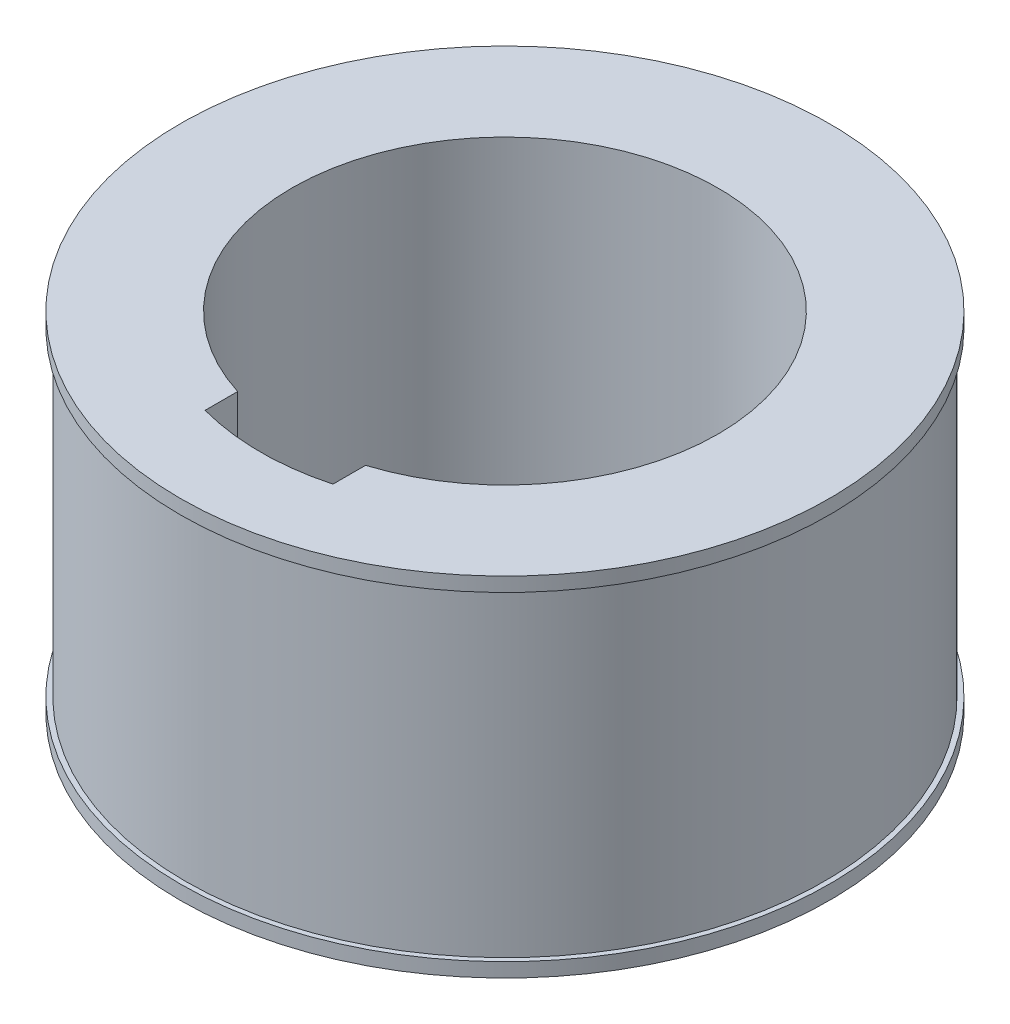
ISO-10303-21;
HEADER;
FILE_DESCRIPTION(('STEP AP214'),'2;1');
FILE_NAME('part.step','',(''),(''),'','','');
FILE_SCHEMA(('AUTOMOTIVE_DESIGN { 1 0 10303 214 1 1 1 1 }'));
ENDSEC;
DATA;
#1=APPLICATION_CONTEXT('core data for automotive mechanical design processes');
#2=APPLICATION_PROTOCOL_DEFINITION('international standard','automotive_design',2000,#1);
#3=PRODUCT_CONTEXT('',#1,'mechanical');
#4=PRODUCT('Part','Part','',(#3));
#5=PRODUCT_RELATED_PRODUCT_CATEGORY('part','',(#4));
#6=PRODUCT_DEFINITION_FORMATION('','',#4);
#7=PRODUCT_DEFINITION_CONTEXT('part definition',#1,'design');
#8=PRODUCT_DEFINITION('design','',#6,#7);
#9=PRODUCT_DEFINITION_SHAPE('','',#8);
#10=(LENGTH_UNIT() NAMED_UNIT(*) SI_UNIT(.MILLI.,.METRE.));
#11=(NAMED_UNIT(*) PLANE_ANGLE_UNIT() SI_UNIT($,.RADIAN.));
#12=(NAMED_UNIT(*) SI_UNIT($,.STERADIAN.) SOLID_ANGLE_UNIT());
#13=UNCERTAINTY_MEASURE_WITH_UNIT(LENGTH_MEASURE(1.E-05),#10,'distance_accuracy_value','');
#14=(GEOMETRIC_REPRESENTATION_CONTEXT(3) GLOBAL_UNCERTAINTY_ASSIGNED_CONTEXT((#13)) GLOBAL_UNIT_ASSIGNED_CONTEXT((#10,
#11,#12)) REPRESENTATION_CONTEXT('',''));
#15=CARTESIAN_POINT('',(0.,0.,0.));
#16=DIRECTION('',(0.,0.,1.));
#17=DIRECTION('',(1.,0.,0.));
#18=AXIS2_PLACEMENT_3D('',#15,#16,#17);
#19=CARTESIAN_POINT('',(0.,22.5,0.));
#20=DIRECTION('',(0.,-1.,0.));
#21=DIRECTION('',(0.,0.,-1.));
#22=AXIS2_PLACEMENT_3D('',#19,#20,#21);
#23=CYLINDRICAL_SURFACE('',#22,45.);
#24=CARTESIAN_POINT('',(0.,22.5,0.));
#25=DIRECTION('',(0.,1.,0.));
#26=DIRECTION('',(0.,0.,1.));
#27=AXIS2_PLACEMENT_3D('',#24,#25,#26);
#28=CIRCLE('',#27,45.);
#29=CARTESIAN_POINT('',(0.,22.5,-45.));
#30=VERTEX_POINT('',#29);
#31=EDGE_CURVE('E11',#30,#30,#28,.T.);
#32=CARTESIAN_POINT('',(0.,-22.5,0.));
#33=DIRECTION('',(0.,1.,0.));
#34=DIRECTION('',(0.,0.,1.));
#35=AXIS2_PLACEMENT_3D('',#32,#33,#34);
#36=CIRCLE('',#35,45.);
#37=CARTESIAN_POINT('',(0.,-22.5,-45.));
#38=VERTEX_POINT('',#37);
#39=EDGE_CURVE('E119',#38,#38,#36,.T.);
#40=CARTESIAN_POINT('',(0.,22.5,-45.));
#41=CARTESIAN_POINT('',(0.,22.03125,-45.));
#42=CARTESIAN_POINT('',(0.,21.5625,-45.));
#43=CARTESIAN_POINT('',(0.,20.625,-45.));
#44=CARTESIAN_POINT('',(0.,20.15625,-45.));
#45=CARTESIAN_POINT('',(0.,19.21875,-45.));
#46=CARTESIAN_POINT('',(0.,18.75,-45.));
#47=CARTESIAN_POINT('',(0.,17.8125,-45.));
#48=CARTESIAN_POINT('',(0.,17.34375,-45.));
#49=CARTESIAN_POINT('',(0.,16.40625,-45.));
#50=CARTESIAN_POINT('',(0.,15.9375,-45.));
#51=CARTESIAN_POINT('',(0.,15.,-45.));
#52=CARTESIAN_POINT('',(0.,14.53125,-45.));
#53=CARTESIAN_POINT('',(0.,13.59375,-45.));
#54=CARTESIAN_POINT('',(0.,13.125,-45.));
#55=CARTESIAN_POINT('',(0.,12.1875,-45.));
#56=CARTESIAN_POINT('',(0.,11.71875,-45.));
#57=CARTESIAN_POINT('',(0.,10.78125,-45.));
#58=CARTESIAN_POINT('',(0.,10.3125,-45.));
#59=CARTESIAN_POINT('',(0.,9.37499999999999,-45.));
#60=CARTESIAN_POINT('',(0.,8.90625,-45.));
#61=CARTESIAN_POINT('',(0.,7.96874999999999,-45.));
#62=CARTESIAN_POINT('',(0.,7.5,-45.));
#63=CARTESIAN_POINT('',(0.,6.5625,-45.));
#64=CARTESIAN_POINT('',(0.,6.09375,-45.));
#65=CARTESIAN_POINT('',(0.,5.15625,-45.));
#66=CARTESIAN_POINT('',(0.,4.6875,-45.));
#67=CARTESIAN_POINT('',(0.,3.75,-45.));
#68=CARTESIAN_POINT('',(0.,3.28125,-45.));
#69=CARTESIAN_POINT('',(0.,2.34375,-45.));
#70=CARTESIAN_POINT('',(0.,1.875,-45.));
#71=CARTESIAN_POINT('',(0.,0.937499999999997,-45.));
#72=CARTESIAN_POINT('',(0.,0.468749999999997,-45.));
#73=CARTESIAN_POINT('',(0.,-0.468750000000004,-45.));
#74=CARTESIAN_POINT('',(0.,-0.937500000000004,-45.));
#75=CARTESIAN_POINT('',(0.,-1.87500000000001,-45.));
#76=CARTESIAN_POINT('',(0.,-2.34375000000001,-45.));
#77=CARTESIAN_POINT('',(0.,-3.28125,-45.));
#78=CARTESIAN_POINT('',(0.,-3.75,-45.));
#79=CARTESIAN_POINT('',(0.,-4.6875,-45.));
#80=CARTESIAN_POINT('',(0.,-5.15625,-45.));
#81=CARTESIAN_POINT('',(0.,-6.09375000000001,-45.));
#82=CARTESIAN_POINT('',(0.,-6.56250000000001,-45.));
#83=CARTESIAN_POINT('',(0.,-7.50000000000001,-45.));
#84=CARTESIAN_POINT('',(0.,-7.96875000000001,-45.));
#85=CARTESIAN_POINT('',(0.,-8.90625,-45.));
#86=CARTESIAN_POINT('',(0.,-9.37500000000001,-45.));
#87=CARTESIAN_POINT('',(0.,-10.3125,-45.));
#88=CARTESIAN_POINT('',(0.,-10.78125,-45.));
#89=CARTESIAN_POINT('',(0.,-11.71875,-45.));
#90=CARTESIAN_POINT('',(0.,-12.1875,-45.));
#91=CARTESIAN_POINT('',(0.,-13.125,-45.));
#92=CARTESIAN_POINT('',(0.,-13.59375,-45.));
#93=CARTESIAN_POINT('',(0.,-14.53125,-45.));
#94=CARTESIAN_POINT('',(0.,-15.,-45.));
#95=CARTESIAN_POINT('',(0.,-15.9375,-45.));
#96=CARTESIAN_POINT('',(0.,-16.40625,-45.));
#97=CARTESIAN_POINT('',(0.,-17.34375,-45.));
#98=CARTESIAN_POINT('',(0.,-17.8125,-45.));
#99=CARTESIAN_POINT('',(0.,-18.75,-45.));
#100=CARTESIAN_POINT('',(0.,-19.21875,-45.));
#101=CARTESIAN_POINT('',(0.,-20.15625,-45.));
#102=CARTESIAN_POINT('',(0.,-20.625,-45.));
#103=CARTESIAN_POINT('',(0.,-21.5625,-45.));
#104=CARTESIAN_POINT('',(0.,-22.03125,-45.));
#105=CARTESIAN_POINT('',(0.,-22.5,-45.));
#106=B_SPLINE_CURVE_WITH_KNOTS('',3,(#40,#41,#42,#43,#44,#45,#46,#47,#48,#49,#50,#51,#52,#53,
#54,#55,#56,#57,#58,#59,#60,#61,#62,#63,#64,#65,#66,#67,#68,#69,#70,#71,#72,#73,#74,#75,#76,#77,
#78,#79,#80,#81,#82,#83,#84,#85,#86,#87,#88,#89,#90,#91,#92,#93,#94,#95,#96,#97,#98,#99,#100,
#101,#102,#103,#104,#105),.UNSPECIFIED.,.F.,.F.,(4,2,2,2,2,2,2,2,2,2,2,2,2,2,2,2,2,2,2,2,2,2,2,
2,2,2,2,2,2,2,2,2,4),(0.,1.40625,2.8125,4.21875,5.625,7.03125,8.4375,9.84375,11.25,12.65625,
14.0625,15.46875,16.875,18.28125,19.6875,21.09375,22.5,23.90625,25.3125,26.71875,28.125,
29.53125,30.9375,32.34375,33.75,35.15625,36.5625,37.96875,39.375,40.78125,42.1875,43.59375,45.),.UNSPECIFIED.);
#107=EDGE_CURVE('BSEAM39',#30,#38,#106,.T.);
#108=ORIENTED_EDGE('',*,*,#31,.F.);
#109=ORIENTED_EDGE('',*,*,#39,.T.);
#110=ORIENTED_EDGE('',*,*,#107,.T.);
#111=ORIENTED_EDGE('',*,*,#107,.F.);
#112=EDGE_LOOP('',(#108,#110,#109,#111));
#113=FACE_BOUND('',#112,.T.);
#114=ADVANCED_FACE('F39',(#113),#23,.T.);
#115=CARTESIAN_POINT('',(0.,24.5,0.));
#116=DIRECTION('',(0.,-1.,0.));
#117=DIRECTION('',(0.,0.,-1.));
#118=AXIS2_PLACEMENT_3D('',#115,#116,#117);
#119=CYLINDRICAL_SURFACE('',#118,45.69);
#120=CARTESIAN_POINT('',(0.,24.5,0.));
#121=DIRECTION('',(0.,1.,0.));
#122=DIRECTION('',(0.,0.,1.));
#123=AXIS2_PLACEMENT_3D('',#120,#121,#122);
#124=CIRCLE('',#123,45.69);
#125=CARTESIAN_POINT('',(0.,24.5,45.69));
#126=VERTEX_POINT('',#125);
#127=EDGE_CURVE('E47',#126,#126,#124,.T.);
#128=ORIENTED_EDGE('',*,*,#127,.F.);
#129=EDGE_LOOP('',(#128));
#130=FACE_BOUND('',#129,.T.);
#131=CARTESIAN_POINT('',(0.,22.5,0.));
#132=DIRECTION('',(0.,1.,0.));
#133=DIRECTION('',(0.,0.,1.));
#134=AXIS2_PLACEMENT_3D('',#131,#132,#133);
#135=CIRCLE('',#134,45.69);
#136=CARTESIAN_POINT('',(0.,22.5,45.69));
#137=VERTEX_POINT('',#136);
#138=EDGE_CURVE('E125',#137,#137,#135,.T.);
#139=ORIENTED_EDGE('',*,*,#138,.T.);
#140=EDGE_LOOP('',(#139));
#141=FACE_BOUND('',#140,.T.);
#142=ADVANCED_FACE('F163',(#130,#141),#119,.T.);
#143=CARTESIAN_POINT('',(0.,24.5,0.));
#144=DIRECTION('',(0.,1.,0.));
#145=DIRECTION('',(0.,0.,1.));
#146=AXIS2_PLACEMENT_3D('',#143,#144,#145);
#147=PLANE('',#146);
#148=DIRECTION('',(0.,0.,1.));
#149=VECTOR('',#148,1.);
#150=CARTESIAN_POINT('',(9.,24.5,28.6181760425084));
#151=LINE('',#150,#149);
#152=CARTESIAN_POINT('',(9.,24.5,28.6181760425084));
#153=VERTEX_POINT('',#152);
#154=CARTESIAN_POINT('',(9.,24.5,33.2018071797304));
#155=VERTEX_POINT('',#154);
#156=EDGE_CURVE('E100',#153,#155,#151,.T.);
#157=ORIENTED_EDGE('',*,*,#156,.T.);
#158=CARTESIAN_POINT('',(0.,24.5,0.));
#159=DIRECTION('',(0.,-1.,0.));
#160=DIRECTION('',(0.,0.,-1.));
#161=AXIS2_PLACEMENT_3D('',#158,#159,#160);
#162=CIRCLE('',#161,34.4);
#163=CARTESIAN_POINT('',(-9.,24.5,33.2018071797304));
#164=VERTEX_POINT('',#163);
#165=EDGE_CURVE('E99',#155,#164,#162,.T.);
#166=ORIENTED_EDGE('',*,*,#165,.T.);
#167=DIRECTION('',(0.,0.,-1.));
#168=VECTOR('',#167,1.);
#169=CARTESIAN_POINT('',(-9.,24.5,28.6181760425084));
#170=LINE('',#169,#168);
#171=CARTESIAN_POINT('',(-8.99999999999999,24.5,28.6181760425084));
#172=VERTEX_POINT('',#171);
#173=EDGE_CURVE('E85',#164,#172,#170,.T.);
#174=ORIENTED_EDGE('',*,*,#173,.T.);
#175=CARTESIAN_POINT('',(0.,24.5,0.));
#176=DIRECTION('',(0.,-1.,0.));
#177=DIRECTION('',(0.,0.,-1.));
#178=AXIS2_PLACEMENT_3D('',#175,#176,#177);
#179=CIRCLE('',#178,30.);
#180=EDGE_CURVE('E98',#172,#153,#179,.T.);
#181=ORIENTED_EDGE('',*,*,#180,.T.);
#182=EDGE_LOOP('',(#157,#166,#174,#181));
#183=FACE_BOUND('',#182,.T.);
#184=ORIENTED_EDGE('',*,*,#127,.T.);
#185=EDGE_LOOP('',(#184));
#186=FACE_BOUND('',#185,.T.);
#187=ADVANCED_FACE('F96',(#183,#186),#147,.T.);
#188=CARTESIAN_POINT('',(0.,22.5,0.));
#189=DIRECTION('',(0.,1.,0.));
#190=DIRECTION('',(0.,0.,1.));
#191=AXIS2_PLACEMENT_3D('',#188,#189,#190);
#192=PLANE('',#191);
#193=ORIENTED_EDGE('',*,*,#31,.T.);
#194=EDGE_LOOP('',(#193));
#195=FACE_BOUND('',#194,.T.);
#196=ORIENTED_EDGE('',*,*,#138,.F.);
#197=EDGE_LOOP('',(#196));
#198=FACE_BOUND('',#197,.T.);
#199=ADVANCED_FACE('F149',(#195,#198),#192,.F.);
#200=CARTESIAN_POINT('',(0.,-24.5,0.));
#201=DIRECTION('',(0.,1.,0.));
#202=DIRECTION('',(0.,0.,1.));
#203=AXIS2_PLACEMENT_3D('',#200,#201,#202);
#204=CYLINDRICAL_SURFACE('',#203,45.69);
#205=CARTESIAN_POINT('',(0.,-24.5,0.));
#206=DIRECTION('',(0.,1.,0.));
#207=DIRECTION('',(0.,0.,1.));
#208=AXIS2_PLACEMENT_3D('',#205,#206,#207);
#209=CIRCLE('',#208,45.69);
#210=CARTESIAN_POINT('',(0.,-24.5,45.69));
#211=VERTEX_POINT('',#210);
#212=EDGE_CURVE('E116',#211,#211,#209,.T.);
#213=ORIENTED_EDGE('',*,*,#212,.T.);
#214=EDGE_LOOP('',(#213));
#215=FACE_BOUND('',#214,.T.);
#216=CARTESIAN_POINT('',(0.,-22.5,0.));
#217=DIRECTION('',(0.,1.,0.));
#218=DIRECTION('',(0.,0.,1.));
#219=AXIS2_PLACEMENT_3D('',#216,#217,#218);
#220=CIRCLE('',#219,45.69);
#221=CARTESIAN_POINT('',(0.,-22.5,45.69));
#222=VERTEX_POINT('',#221);
#223=EDGE_CURVE('E120',#222,#222,#220,.T.);
#224=ORIENTED_EDGE('',*,*,#223,.F.);
#225=EDGE_LOOP('',(#224));
#226=FACE_BOUND('',#225,.T.);
#227=ADVANCED_FACE('F142',(#215,#226),#204,.T.);
#228=CARTESIAN_POINT('',(0.,-24.5,0.));
#229=DIRECTION('',(0.,-1.,0.));
#230=DIRECTION('',(0.,0.,1.));
#231=AXIS2_PLACEMENT_3D('',#228,#229,#230);
#232=PLANE('',#231);
#233=CARTESIAN_POINT('',(0.,-24.5,0.));
#234=DIRECTION('',(0.,-1.,0.));
#235=DIRECTION('',(0.,0.,-1.));
#236=AXIS2_PLACEMENT_3D('',#233,#234,#235);
#237=CIRCLE('',#236,40.);
#238=CARTESIAN_POINT('',(0.,-24.5,-40.));
#239=VERTEX_POINT('',#238);
#240=EDGE_CURVE('E42',#239,#239,#237,.T.);
#241=ORIENTED_EDGE('',*,*,#240,.F.);
#242=EDGE_LOOP('',(#241));
#243=FACE_BOUND('',#242,.T.);
#244=ORIENTED_EDGE('',*,*,#212,.F.);
#245=EDGE_LOOP('',(#244));
#246=FACE_BOUND('',#245,.T.);
#247=ADVANCED_FACE('F138',(#243,#246),#232,.T.);
#248=CARTESIAN_POINT('',(0.,-22.5,0.));
#249=DIRECTION('',(0.,-1.,0.));
#250=DIRECTION('',(0.,0.,1.));
#251=AXIS2_PLACEMENT_3D('',#248,#249,#250);
#252=PLANE('',#251);
#253=ORIENTED_EDGE('',*,*,#39,.F.);
#254=EDGE_LOOP('',(#253));
#255=FACE_BOUND('',#254,.T.);
#256=ORIENTED_EDGE('',*,*,#223,.T.);
#257=EDGE_LOOP('',(#256));
#258=FACE_BOUND('',#257,.T.);
#259=ADVANCED_FACE('F141',(#255,#258),#252,.F.);
#260=CARTESIAN_POINT('',(0.,-32.,0.));
#261=DIRECTION('',(0.,1.,0.));
#262=DIRECTION('',(0.,0.,1.));
#263=AXIS2_PLACEMENT_3D('',#260,#261,#262);
#264=CYLINDRICAL_SURFACE('',#263,40.);
#265=ORIENTED_EDGE('',*,*,#240,.T.);
#266=EDGE_LOOP('',(#265));
#267=FACE_BOUND('',#266,.T.);
#268=CARTESIAN_POINT('',(0.,0.,0.));
#269=DIRECTION('',(0.,1.,0.));
#270=DIRECTION('',(0.,0.,1.));
#271=AXIS2_PLACEMENT_3D('',#268,#269,#270);
#272=CIRCLE('',#271,40.);
#273=CARTESIAN_POINT('',(0.,0.,40.));
#274=VERTEX_POINT('',#273);
#275=EDGE_CURVE('E108',#274,#274,#272,.T.);
#276=ORIENTED_EDGE('',*,*,#275,.T.);
#277=EDGE_LOOP('',(#276));
#278=FACE_BOUND('',#277,.T.);
#279=ADVANCED_FACE('F135',(#267,#278),#264,.F.);
#280=CARTESIAN_POINT('',(0.,0.,0.));
#281=DIRECTION('',(0.,1.,0.));
#282=DIRECTION('',(0.,0.,1.));
#283=AXIS2_PLACEMENT_3D('',#280,#281,#282);
#284=PLANE('',#283);
#285=CARTESIAN_POINT('',(0.,0.,0.));
#286=DIRECTION('',(0.,1.,0.));
#287=DIRECTION('',(0.,0.,1.));
#288=AXIS2_PLACEMENT_3D('',#285,#286,#287);
#289=CIRCLE('',#288,38.);
#290=CARTESIAN_POINT('',(0.,0.,38.));
#291=VERTEX_POINT('',#290);
#292=EDGE_CURVE('E104',#291,#291,#289,.T.);
#293=ORIENTED_EDGE('',*,*,#292,.T.);
#294=EDGE_LOOP('',(#293));
#295=FACE_BOUND('',#294,.T.);
#296=ORIENTED_EDGE('',*,*,#275,.F.);
#297=EDGE_LOOP('',(#296));
#298=FACE_BOUND('',#297,.T.);
#299=ADVANCED_FACE('F159',(#295,#298),#284,.F.);
#300=CARTESIAN_POINT('',(0.,-32.,0.));
#301=DIRECTION('',(0.,1.,0.));
#302=DIRECTION('',(0.,0.,1.));
#303=AXIS2_PLACEMENT_3D('',#300,#301,#302);
#304=CYLINDRICAL_SURFACE('',#303,38.);
#305=CARTESIAN_POINT('',(0.,-24.5,0.));
#306=DIRECTION('',(0.,-1.,0.));
#307=DIRECTION('',(0.,0.,-1.));
#308=AXIS2_PLACEMENT_3D('',#305,#306,#307);
#309=CIRCLE('',#308,38.);
#310=CARTESIAN_POINT('',(0.,-24.5,-38.));
#311=VERTEX_POINT('',#310);
#312=EDGE_CURVE('E115',#311,#311,#309,.T.);
#313=ORIENTED_EDGE('',*,*,#312,.F.);
#314=EDGE_LOOP('',(#313));
#315=FACE_BOUND('',#314,.T.);
#316=ORIENTED_EDGE('',*,*,#292,.F.);
#317=EDGE_LOOP('',(#316));
#318=FACE_BOUND('',#317,.T.);
#319=ADVANCED_FACE('F189',(#315,#318),#304,.T.);
#320=DIRECTION('',(0.,0.,1.));
#321=VECTOR('',#320,1.);
#322=CARTESIAN_POINT('',(9.,-24.5,28.6181760425084));
#323=LINE('',#322,#321);
#324=CARTESIAN_POINT('',(9.,-24.5,28.6181760425084));
#325=VERTEX_POINT('',#324);
#326=CARTESIAN_POINT('',(9.,-24.5,33.2018071797304));
#327=VERTEX_POINT('',#326);
#328=EDGE_CURVE('E289',#325,#327,#323,.T.);
#329=ORIENTED_EDGE('',*,*,#328,.F.);
#330=CARTESIAN_POINT('',(0.,-24.5,0.));
#331=DIRECTION('',(0.,-1.,0.));
#332=DIRECTION('',(0.,0.,-1.));
#333=AXIS2_PLACEMENT_3D('',#330,#331,#332);
#334=CIRCLE('',#333,30.);
#335=CARTESIAN_POINT('',(-8.99999999999999,-24.5,28.6181760425084));
#336=VERTEX_POINT('',#335);
#337=EDGE_CURVE('E105',#336,#325,#334,.T.);
#338=ORIENTED_EDGE('',*,*,#337,.F.);
#339=DIRECTION('',(0.,0.,-1.));
#340=VECTOR('',#339,1.);
#341=CARTESIAN_POINT('',(-9.,-24.5,28.6181760425084));
#342=LINE('',#341,#340);
#343=CARTESIAN_POINT('',(-9.,-24.5,33.2018071797304));
#344=VERTEX_POINT('',#343);
#345=EDGE_CURVE('E55',#344,#336,#342,.T.);
#346=ORIENTED_EDGE('',*,*,#345,.F.);
#347=CARTESIAN_POINT('',(0.,-24.5,0.));
#348=DIRECTION('',(0.,-1.,0.));
#349=DIRECTION('',(0.,0.,-1.));
#350=AXIS2_PLACEMENT_3D('',#347,#348,#349);
#351=CIRCLE('',#350,34.4);
#352=EDGE_CURVE('E292',#327,#344,#351,.T.);
#353=ORIENTED_EDGE('',*,*,#352,.F.);
#354=EDGE_LOOP('',(#329,#338,#346,#353));
#355=FACE_BOUND('',#354,.T.);
#356=ORIENTED_EDGE('',*,*,#312,.T.);
#357=EDGE_LOOP('',(#356));
#358=FACE_BOUND('',#357,.T.);
#359=ADVANCED_FACE('F144',(#355,#358),#232,.T.);
#360=CARTESIAN_POINT('',(0.,24.5,0.));
#361=DIRECTION('',(0.,-1.,0.));
#362=DIRECTION('',(0.,0.,-1.));
#363=AXIS2_PLACEMENT_3D('',#360,#361,#362);
#364=CYLINDRICAL_SURFACE('',#363,30.);
#365=ORIENTED_EDGE('',*,*,#337,.T.);
#366=DIRECTION('',(0.,-1.,0.));
#367=VECTOR('',#366,1.);
#368=CARTESIAN_POINT('',(9.,24.5,28.6181760425084));
#369=LINE('',#368,#367);
#370=EDGE_CURVE('E91',#153,#325,#369,.T.);
#371=ORIENTED_EDGE('',*,*,#370,.F.);
#372=ORIENTED_EDGE('',*,*,#180,.F.);
#373=DIRECTION('',(0.,-1.,0.));
#374=VECTOR('',#373,1.);
#375=CARTESIAN_POINT('',(-8.99999999999999,24.5,28.6181760425084));
#376=LINE('',#375,#374);
#377=EDGE_CURVE('E82',#172,#336,#376,.T.);
#378=ORIENTED_EDGE('',*,*,#377,.T.);
#379=EDGE_LOOP('',(#365,#371,#372,#378));
#380=FACE_BOUND('',#379,.T.);
#381=ADVANCED_FACE('F103',(#380),#364,.F.);
#382=CARTESIAN_POINT('',(0.,24.5,0.));
#383=DIRECTION('',(0.,-1.,0.));
#384=DIRECTION('',(0.,0.,-1.));
#385=AXIS2_PLACEMENT_3D('',#382,#383,#384);
#386=CYLINDRICAL_SURFACE('',#385,34.4);
#387=ORIENTED_EDGE('',*,*,#352,.T.);
#388=DIRECTION('',(0.,-1.,0.));
#389=VECTOR('',#388,1.);
#390=CARTESIAN_POINT('',(-9.,24.5,33.2018071797304));
#391=LINE('',#390,#389);
#392=EDGE_CURVE('E80',#164,#344,#391,.T.);
#393=ORIENTED_EDGE('',*,*,#392,.F.);
#394=ORIENTED_EDGE('',*,*,#165,.F.);
#395=DIRECTION('',(0.,-1.,0.));
#396=VECTOR('',#395,1.);
#397=CARTESIAN_POINT('',(9.,24.5,33.2018071797304));
#398=LINE('',#397,#396);
#399=EDGE_CURVE('E64',#155,#327,#398,.T.);
#400=ORIENTED_EDGE('',*,*,#399,.T.);
#401=EDGE_LOOP('',(#387,#393,#394,#400));
#402=FACE_BOUND('',#401,.T.);
#403=ADVANCED_FACE('F204',(#402),#386,.F.);
#404=CARTESIAN_POINT('',(9.,24.5,28.6181760425084));
#405=DIRECTION('',(1.,0.,0.));
#406=DIRECTION('',(0.,0.,-1.));
#407=AXIS2_PLACEMENT_3D('',#404,#405,#406);
#408=PLANE('',#407);
#409=ORIENTED_EDGE('',*,*,#328,.T.);
#410=ORIENTED_EDGE('',*,*,#399,.F.);
#411=ORIENTED_EDGE('',*,*,#156,.F.);
#412=ORIENTED_EDGE('',*,*,#370,.T.);
#413=EDGE_LOOP('',(#409,#410,#411,#412));
#414=FACE_BOUND('',#413,.T.);
#415=ADVANCED_FACE('F212',(#414),#408,.F.);
#416=CARTESIAN_POINT('',(-9.,24.5,28.6181760425084));
#417=DIRECTION('',(-1.,0.,0.));
#418=DIRECTION('',(0.,0.,1.));
#419=AXIS2_PLACEMENT_3D('',#416,#417,#418);
#420=PLANE('',#419);
#421=ORIENTED_EDGE('',*,*,#345,.T.);
#422=ORIENTED_EDGE('',*,*,#377,.F.);
#423=ORIENTED_EDGE('',*,*,#173,.F.);
#424=ORIENTED_EDGE('',*,*,#392,.T.);
#425=EDGE_LOOP('',(#421,#422,#423,#424));
#426=FACE_BOUND('',#425,.T.);
#427=ADVANCED_FACE('F84',(#426),#420,.F.);
#428=CLOSED_SHELL('',(#114,#142,#187,#199,#227,#247,#259,#279,#299,#319,#359,#381,#403,#415,#427));
#429=MANIFOLD_SOLID_BREP('B2',#428);
#430=ADVANCED_BREP_SHAPE_REPRESENTATION('',(#18,#429),#14);
#431=SHAPE_DEFINITION_REPRESENTATION(#9,#430);
ENDSEC;
END-ISO-10303-21;
